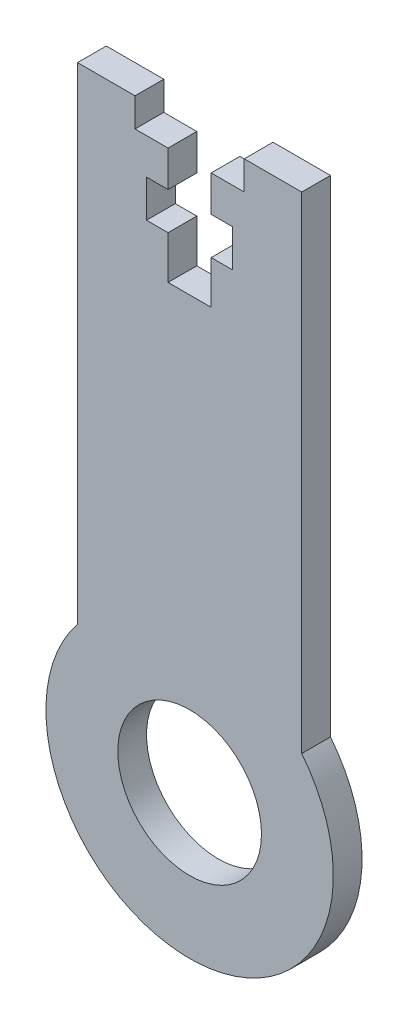
ISO-10303-21;
HEADER;
FILE_DESCRIPTION(('STEP AP214'),'2;1');
FILE_NAME('part.step','',(''),(''),'','','');
FILE_SCHEMA(('AUTOMOTIVE_DESIGN { 1 0 10303 214 1 1 1 1 }'));
ENDSEC;
DATA;
#1=APPLICATION_CONTEXT('core data for automotive mechanical design processes');
#2=APPLICATION_PROTOCOL_DEFINITION('international standard','automotive_design',2000,#1);
#3=PRODUCT_CONTEXT('',#1,'mechanical');
#4=PRODUCT('Part','Part','',(#3));
#5=PRODUCT_RELATED_PRODUCT_CATEGORY('part','',(#4));
#6=PRODUCT_DEFINITION_FORMATION('','',#4);
#7=PRODUCT_DEFINITION_CONTEXT('part definition',#1,'design');
#8=PRODUCT_DEFINITION('design','',#6,#7);
#9=PRODUCT_DEFINITION_SHAPE('','',#8);
#10=(LENGTH_UNIT() NAMED_UNIT(*) SI_UNIT(.MILLI.,.METRE.));
#11=(NAMED_UNIT(*) PLANE_ANGLE_UNIT() SI_UNIT($,.RADIAN.));
#12=(NAMED_UNIT(*) SI_UNIT($,.STERADIAN.) SOLID_ANGLE_UNIT());
#13=UNCERTAINTY_MEASURE_WITH_UNIT(LENGTH_MEASURE(1.E-05),#10,'distance_accuracy_value','');
#14=(GEOMETRIC_REPRESENTATION_CONTEXT(3) GLOBAL_UNCERTAINTY_ASSIGNED_CONTEXT((#13)) GLOBAL_UNIT_ASSIGNED_CONTEXT((#10,
#11,#12)) REPRESENTATION_CONTEXT('',''));
#15=CARTESIAN_POINT('',(0.,0.,0.));
#16=DIRECTION('',(0.,0.,1.));
#17=DIRECTION('',(1.,0.,0.));
#18=AXIS2_PLACEMENT_3D('',#15,#16,#17);
#19=CARTESIAN_POINT('',(-0.746895076948331,-11.2423879612165,2.));
#20=DIRECTION('',(0.,0.,-1.));
#21=DIRECTION('',(-1.,0.,0.));
#22=AXIS2_PLACEMENT_3D('',#19,#20,#21);
#23=PLANE('',#22);
#24=CARTESIAN_POINT('',(-0.746895076948331,-11.2423879612165,2.));
#25=DIRECTION('',(0.,0.,1.));
#26=DIRECTION('',(-1.,0.,0.));
#27=AXIS2_PLACEMENT_3D('',#24,#25,#26);
#28=CIRCLE('',#27,10.);
#29=CARTESIAN_POINT('',(-8.54689507694833,-4.98459282235165,2.));
#30=VERTEX_POINT('',#29);
#31=CARTESIAN_POINT('',(7.05310492305166,-4.98459282235164,2.));
#32=VERTEX_POINT('',#31);
#33=EDGE_CURVE('E243',#30,#32,#28,.T.);
#34=ORIENTED_EDGE('',*,*,#33,.T.);
#35=DIRECTION('',(0.,1.,0.));
#36=VECTOR('',#35,1.);
#37=CARTESIAN_POINT('',(7.05310492305166,-4.98459282235164,2.));
#38=LINE('',#37,#36);
#39=CARTESIAN_POINT('',(7.05310492305155,28.8576120387834,2.));
#40=VERTEX_POINT('',#39);
#41=EDGE_CURVE('E131',#32,#40,#38,.T.);
#42=ORIENTED_EDGE('',*,*,#41,.T.);
#43=DIRECTION('',(-1.,0.,0.));
#44=VECTOR('',#43,1.);
#45=CARTESIAN_POINT('',(3.05310492305092,28.8576120387834,2.));
#46=LINE('',#45,#44);
#47=CARTESIAN_POINT('',(3.05310492305092,28.8576120387834,2.));
#48=VERTEX_POINT('',#47);
#49=EDGE_CURVE('E294',#40,#48,#46,.T.);
#50=ORIENTED_EDGE('',*,*,#49,.T.);
#51=DIRECTION('',(0.,-1.,0.));
#52=VECTOR('',#51,1.);
#53=CARTESIAN_POINT('',(3.05310492305092,26.8576120387834,2.));
#54=LINE('',#53,#52);
#55=CARTESIAN_POINT('',(3.05310492305092,26.8576120387834,2.));
#56=VERTEX_POINT('',#55);
#57=EDGE_CURVE('E313',#48,#56,#54,.T.);
#58=ORIENTED_EDGE('',*,*,#57,.T.);
#59=DIRECTION('',(-1.,0.,0.));
#60=VECTOR('',#59,1.);
#61=CARTESIAN_POINT('',(0.753104923050919,26.8576120387834,2.));
#62=LINE('',#61,#60);
#63=CARTESIAN_POINT('',(0.753104923050919,26.8576120387834,2.));
#64=VERTEX_POINT('',#63);
#65=EDGE_CURVE('E310',#56,#64,#62,.T.);
#66=ORIENTED_EDGE('',*,*,#65,.T.);
#67=DIRECTION('',(0.,-1.,0.));
#68=VECTOR('',#67,1.);
#69=CARTESIAN_POINT('',(0.753104923050919,24.3576120387838,2.));
#70=LINE('',#69,#68);
#71=CARTESIAN_POINT('',(0.753104923050919,24.3576120387838,2.));
#72=VERTEX_POINT('',#71);
#73=EDGE_CURVE('E312',#64,#72,#70,.T.);
#74=ORIENTED_EDGE('',*,*,#73,.T.);
#75=DIRECTION('',(1.,0.,0.));
#76=VECTOR('',#75,1.);
#77=CARTESIAN_POINT('',(0.753104923050919,24.3576120387838,2.));
#78=LINE('',#77,#76);
#79=CARTESIAN_POINT('',(2.25310492305059,24.3576120387838,2.));
#80=VERTEX_POINT('',#79);
#81=EDGE_CURVE('E315',#72,#80,#78,.T.);
#82=ORIENTED_EDGE('',*,*,#81,.T.);
#83=DIRECTION('',(0.,-1.,0.));
#84=VECTOR('',#83,1.);
#85=CARTESIAN_POINT('',(2.25310492305059,24.3576120387838,2.));
#86=LINE('',#85,#84);
#87=CARTESIAN_POINT('',(2.25310492305059,21.757612038784,2.));
#88=VERTEX_POINT('',#87);
#89=EDGE_CURVE('E321',#80,#88,#86,.T.);
#90=ORIENTED_EDGE('',*,*,#89,.T.);
#91=DIRECTION('',(-1.,0.,0.));
#92=VECTOR('',#91,1.);
#93=CARTESIAN_POINT('',(2.25310492305059,21.757612038784,2.));
#94=LINE('',#93,#92);
#95=CARTESIAN_POINT('',(0.753104923037457,21.757612038784,2.));
#96=VERTEX_POINT('',#95);
#97=EDGE_CURVE('E323',#88,#96,#94,.T.);
#98=ORIENTED_EDGE('',*,*,#97,.T.);
#99=DIRECTION('',(0.,-1.,0.));
#100=VECTOR('',#99,1.);
#101=CARTESIAN_POINT('',(0.753104923037457,21.757612038784,2.));
#102=LINE('',#101,#100);
#103=CARTESIAN_POINT('',(0.753104923037457,18.7576120387835,2.));
#104=VERTEX_POINT('',#103);
#105=EDGE_CURVE('E325',#96,#104,#102,.T.);
#106=ORIENTED_EDGE('',*,*,#105,.T.);
#107=DIRECTION('',(-1.,0.,0.));
#108=VECTOR('',#107,1.);
#109=CARTESIAN_POINT('',(-2.24689507693412,18.7576120387835,2.));
#110=LINE('',#109,#108);
#111=CARTESIAN_POINT('',(-2.24689507693412,18.7576120387835,2.));
#112=VERTEX_POINT('',#111);
#113=EDGE_CURVE('E327',#104,#112,#110,.T.);
#114=ORIENTED_EDGE('',*,*,#113,.T.);
#115=DIRECTION('',(0.,1.,0.));
#116=VECTOR('',#115,1.);
#117=CARTESIAN_POINT('',(-2.24689507693412,21.7576120387831,2.));
#118=LINE('',#117,#116);
#119=CARTESIAN_POINT('',(-2.24689507693412,21.7576120387831,2.));
#120=VERTEX_POINT('',#119);
#121=EDGE_CURVE('E329',#112,#120,#118,.T.);
#122=ORIENTED_EDGE('',*,*,#121,.T.);
#123=DIRECTION('',(-1.,0.,0.));
#124=VECTOR('',#123,1.);
#125=CARTESIAN_POINT('',(-3.74689507694834,21.7576120387831,2.));
#126=LINE('',#125,#124);
#127=CARTESIAN_POINT('',(-3.74689507694834,21.7576120387831,2.));
#128=VERTEX_POINT('',#127);
#129=EDGE_CURVE('E331',#120,#128,#126,.T.);
#130=ORIENTED_EDGE('',*,*,#129,.T.);
#131=DIRECTION('',(0.,1.,0.));
#132=VECTOR('',#131,1.);
#133=CARTESIAN_POINT('',(-3.74689507694834,24.3576120387838,2.));
#134=LINE('',#133,#132);
#135=CARTESIAN_POINT('',(-3.74689507694834,24.3576120387838,2.));
#136=VERTEX_POINT('',#135);
#137=EDGE_CURVE('E333',#128,#136,#134,.T.);
#138=ORIENTED_EDGE('',*,*,#137,.T.);
#139=DIRECTION('',(1.,0.,0.));
#140=VECTOR('',#139,1.);
#141=CARTESIAN_POINT('',(-2.24689507694845,24.3576120387838,2.));
#142=LINE('',#141,#140);
#143=CARTESIAN_POINT('',(-2.24689507694845,24.3576120387838,2.));
#144=VERTEX_POINT('',#143);
#145=EDGE_CURVE('E335',#136,#144,#142,.T.);
#146=ORIENTED_EDGE('',*,*,#145,.T.);
#147=DIRECTION('',(0.,1.,0.));
#148=VECTOR('',#147,1.);
#149=CARTESIAN_POINT('',(-2.24689507694845,24.3576120387838,2.));
#150=LINE('',#149,#148);
#151=CARTESIAN_POINT('',(-2.24689507694845,26.8576120387834,2.));
#152=VERTEX_POINT('',#151);
#153=EDGE_CURVE('E337',#144,#152,#150,.T.);
#154=ORIENTED_EDGE('',*,*,#153,.T.);
#155=DIRECTION('',(-1.,0.,0.));
#156=VECTOR('',#155,1.);
#157=CARTESIAN_POINT('',(-4.54689507694845,26.8576120387834,2.));
#158=LINE('',#157,#156);
#159=CARTESIAN_POINT('',(-4.54689507694845,26.8576120387834,2.));
#160=VERTEX_POINT('',#159);
#161=EDGE_CURVE('E186',#152,#160,#158,.T.);
#162=ORIENTED_EDGE('',*,*,#161,.T.);
#163=DIRECTION('',(0.,1.,0.));
#164=VECTOR('',#163,1.);
#165=CARTESIAN_POINT('',(-4.54689507694845,28.8576120387834,2.));
#166=LINE('',#165,#164);
#167=CARTESIAN_POINT('',(-4.54689507694845,28.8576120387834,2.));
#168=VERTEX_POINT('',#167);
#169=EDGE_CURVE('E180',#160,#168,#166,.T.);
#170=ORIENTED_EDGE('',*,*,#169,.T.);
#171=DIRECTION('',(-1.,0.,0.));
#172=VECTOR('',#171,1.);
#173=CARTESIAN_POINT('',(-4.54689507694845,28.8576120387834,2.));
#174=LINE('',#173,#172);
#175=CARTESIAN_POINT('',(-8.54689507694845,28.8576120387834,2.));
#176=VERTEX_POINT('',#175);
#177=EDGE_CURVE('E184',#168,#176,#174,.T.);
#178=ORIENTED_EDGE('',*,*,#177,.T.);
#179=DIRECTION('',(0.,-1.,0.));
#180=VECTOR('',#179,1.);
#181=CARTESIAN_POINT('',(-8.54689507694845,28.8576120387834,2.));
#182=LINE('',#181,#180);
#183=EDGE_CURVE('E52',#176,#30,#182,.T.);
#184=ORIENTED_EDGE('',*,*,#183,.T.);
#185=EDGE_LOOP('',(#34,#42,#50,#58,#66,#74,#82,#90,#98,#106,#114,#122,#130,#138,#146,#154,#162,
#170,#178,#184));
#186=FACE_BOUND('',#185,.T.);
#187=CARTESIAN_POINT('',(-0.746895076948334,-11.2423879612165,2.));
#188=DIRECTION('',(0.,0.,1.));
#189=DIRECTION('',(1.,0.,0.));
#190=AXIS2_PLACEMENT_3D('',#187,#188,#189);
#191=CIRCLE('',#190,5.);
#192=CARTESIAN_POINT('',(4.25310492305167,-11.2423879612165,2.));
#193=VERTEX_POINT('',#192);
#194=EDGE_CURVE('E208',#193,#193,#191,.T.);
#195=ORIENTED_EDGE('',*,*,#194,.F.);
#196=EDGE_LOOP('',(#195));
#197=FACE_BOUND('',#196,.T.);
#198=ADVANCED_FACE('F35',(#186,#197),#23,.F.);
#199=CARTESIAN_POINT('',(-0.746895076948331,-11.2423879612165,0.));
#200=DIRECTION('',(0.,0.,-1.));
#201=DIRECTION('',(-1.,0.,0.));
#202=AXIS2_PLACEMENT_3D('',#199,#200,#201);
#203=PLANE('',#202);
#204=CARTESIAN_POINT('',(-0.746895076948331,-11.2423879612165,0.));
#205=DIRECTION('',(0.,0.,1.));
#206=DIRECTION('',(-1.,0.,0.));
#207=AXIS2_PLACEMENT_3D('',#204,#205,#206);
#208=CIRCLE('',#207,10.);
#209=CARTESIAN_POINT('',(-8.54689507694833,-4.98459282235165,0.));
#210=VERTEX_POINT('',#209);
#211=CARTESIAN_POINT('',(7.05310492305166,-4.98459282235164,0.));
#212=VERTEX_POINT('',#211);
#213=EDGE_CURVE('E204',#210,#212,#208,.T.);
#214=ORIENTED_EDGE('',*,*,#213,.F.);
#215=DIRECTION('',(0.,-1.,0.));
#216=VECTOR('',#215,1.);
#217=CARTESIAN_POINT('',(-8.54689507694845,28.8576120387834,0.));
#218=LINE('',#217,#216);
#219=CARTESIAN_POINT('',(-8.54689507694845,28.8576120387834,0.));
#220=VERTEX_POINT('',#219);
#221=EDGE_CURVE('E123',#220,#210,#218,.T.);
#222=ORIENTED_EDGE('',*,*,#221,.F.);
#223=DIRECTION('',(-1.,0.,0.));
#224=VECTOR('',#223,1.);
#225=CARTESIAN_POINT('',(-4.54689507694845,28.8576120387834,0.));
#226=LINE('',#225,#224);
#227=CARTESIAN_POINT('',(-4.54689507694845,28.8576120387834,0.));
#228=VERTEX_POINT('',#227);
#229=EDGE_CURVE('E117',#228,#220,#226,.T.);
#230=ORIENTED_EDGE('',*,*,#229,.F.);
#231=DIRECTION('',(0.,1.,0.));
#232=VECTOR('',#231,1.);
#233=CARTESIAN_POINT('',(-4.54689507694845,28.8576120387834,0.));
#234=LINE('',#233,#232);
#235=CARTESIAN_POINT('',(-4.54689507694845,26.8576120387834,0.));
#236=VERTEX_POINT('',#235);
#237=EDGE_CURVE('E194',#236,#228,#234,.T.);
#238=ORIENTED_EDGE('',*,*,#237,.F.);
#239=DIRECTION('',(-1.,0.,0.));
#240=VECTOR('',#239,1.);
#241=CARTESIAN_POINT('',(-4.54689507694845,26.8576120387834,0.));
#242=LINE('',#241,#240);
#243=CARTESIAN_POINT('',(-2.24689507694845,26.8576120387834,0.));
#244=VERTEX_POINT('',#243);
#245=EDGE_CURVE('E238',#244,#236,#242,.T.);
#246=ORIENTED_EDGE('',*,*,#245,.F.);
#247=DIRECTION('',(0.,1.,0.));
#248=VECTOR('',#247,1.);
#249=CARTESIAN_POINT('',(-2.24689507694845,24.3576120387838,0.));
#250=LINE('',#249,#248);
#251=CARTESIAN_POINT('',(-2.24689507694845,24.3576120387838,0.));
#252=VERTEX_POINT('',#251);
#253=EDGE_CURVE('E236',#252,#244,#250,.T.);
#254=ORIENTED_EDGE('',*,*,#253,.F.);
#255=DIRECTION('',(1.,0.,0.));
#256=VECTOR('',#255,1.);
#257=CARTESIAN_POINT('',(-2.24689507694845,24.3576120387838,0.));
#258=LINE('',#257,#256);
#259=CARTESIAN_POINT('',(-3.74689507694834,24.3576120387838,0.));
#260=VERTEX_POINT('',#259);
#261=EDGE_CURVE('E234',#260,#252,#258,.T.);
#262=ORIENTED_EDGE('',*,*,#261,.F.);
#263=DIRECTION('',(0.,1.,0.));
#264=VECTOR('',#263,1.);
#265=CARTESIAN_POINT('',(-3.74689507694834,24.3576120387838,0.));
#266=LINE('',#265,#264);
#267=CARTESIAN_POINT('',(-3.74689507694834,21.7576120387831,0.));
#268=VERTEX_POINT('',#267);
#269=EDGE_CURVE('E232',#268,#260,#266,.T.);
#270=ORIENTED_EDGE('',*,*,#269,.F.);
#271=DIRECTION('',(-1.,0.,0.));
#272=VECTOR('',#271,1.);
#273=CARTESIAN_POINT('',(-3.74689507694834,21.7576120387831,0.));
#274=LINE('',#273,#272);
#275=CARTESIAN_POINT('',(-2.24689507693412,21.7576120387831,0.));
#276=VERTEX_POINT('',#275);
#277=EDGE_CURVE('E230',#276,#268,#274,.T.);
#278=ORIENTED_EDGE('',*,*,#277,.F.);
#279=DIRECTION('',(0.,1.,0.));
#280=VECTOR('',#279,1.);
#281=CARTESIAN_POINT('',(-2.24689507693412,21.7576120387831,0.));
#282=LINE('',#281,#280);
#283=CARTESIAN_POINT('',(-2.24689507693412,18.7576120387835,0.));
#284=VERTEX_POINT('',#283);
#285=EDGE_CURVE('E228',#284,#276,#282,.T.);
#286=ORIENTED_EDGE('',*,*,#285,.F.);
#287=DIRECTION('',(-1.,0.,0.));
#288=VECTOR('',#287,1.);
#289=CARTESIAN_POINT('',(-2.24689507693412,18.7576120387835,0.));
#290=LINE('',#289,#288);
#291=CARTESIAN_POINT('',(0.753104923037457,18.7576120387835,0.));
#292=VERTEX_POINT('',#291);
#293=EDGE_CURVE('E226',#292,#284,#290,.T.);
#294=ORIENTED_EDGE('',*,*,#293,.F.);
#295=DIRECTION('',(0.,-1.,0.));
#296=VECTOR('',#295,1.);
#297=CARTESIAN_POINT('',(0.753104923037457,21.757612038784,0.));
#298=LINE('',#297,#296);
#299=CARTESIAN_POINT('',(0.753104923037457,21.757612038784,0.));
#300=VERTEX_POINT('',#299);
#301=EDGE_CURVE('E224',#300,#292,#298,.T.);
#302=ORIENTED_EDGE('',*,*,#301,.F.);
#303=DIRECTION('',(-1.,0.,0.));
#304=VECTOR('',#303,1.);
#305=CARTESIAN_POINT('',(2.25310492305059,21.757612038784,0.));
#306=LINE('',#305,#304);
#307=CARTESIAN_POINT('',(2.25310492305059,21.757612038784,0.));
#308=VERTEX_POINT('',#307);
#309=EDGE_CURVE('E222',#308,#300,#306,.T.);
#310=ORIENTED_EDGE('',*,*,#309,.F.);
#311=DIRECTION('',(0.,-1.,0.));
#312=VECTOR('',#311,1.);
#313=CARTESIAN_POINT('',(2.25310492305059,24.3576120387838,0.));
#314=LINE('',#313,#312);
#315=CARTESIAN_POINT('',(2.25310492305059,24.3576120387838,0.));
#316=VERTEX_POINT('',#315);
#317=EDGE_CURVE('E220',#316,#308,#314,.T.);
#318=ORIENTED_EDGE('',*,*,#317,.F.);
#319=DIRECTION('',(1.,0.,0.));
#320=VECTOR('',#319,1.);
#321=CARTESIAN_POINT('',(0.753104923050919,24.3576120387838,0.));
#322=LINE('',#321,#320);
#323=CARTESIAN_POINT('',(0.753104923050919,24.3576120387838,0.));
#324=VERTEX_POINT('',#323);
#325=EDGE_CURVE('E218',#324,#316,#322,.T.);
#326=ORIENTED_EDGE('',*,*,#325,.F.);
#327=DIRECTION('',(0.,-1.,0.));
#328=VECTOR('',#327,1.);
#329=CARTESIAN_POINT('',(0.753104923050919,24.3576120387838,0.));
#330=LINE('',#329,#328);
#331=CARTESIAN_POINT('',(0.753104923050919,26.8576120387834,0.));
#332=VERTEX_POINT('',#331);
#333=EDGE_CURVE('E216',#332,#324,#330,.T.);
#334=ORIENTED_EDGE('',*,*,#333,.F.);
#335=DIRECTION('',(-1.,0.,0.));
#336=VECTOR('',#335,1.);
#337=CARTESIAN_POINT('',(0.753104923050919,26.8576120387834,0.));
#338=LINE('',#337,#336);
#339=CARTESIAN_POINT('',(3.05310492305092,26.8576120387834,0.));
#340=VERTEX_POINT('',#339);
#341=EDGE_CURVE('E214',#340,#332,#338,.T.);
#342=ORIENTED_EDGE('',*,*,#341,.F.);
#343=DIRECTION('',(0.,-1.,0.));
#344=VECTOR('',#343,1.);
#345=CARTESIAN_POINT('',(3.05310492305092,26.8576120387834,0.));
#346=LINE('',#345,#344);
#347=CARTESIAN_POINT('',(3.05310492305092,28.8576120387834,0.));
#348=VERTEX_POINT('',#347);
#349=EDGE_CURVE('E212',#348,#340,#346,.T.);
#350=ORIENTED_EDGE('',*,*,#349,.F.);
#351=DIRECTION('',(-1.,0.,0.));
#352=VECTOR('',#351,1.);
#353=CARTESIAN_POINT('',(3.05310492305092,28.8576120387834,0.));
#354=LINE('',#353,#352);
#355=CARTESIAN_POINT('',(7.05310492305155,28.8576120387834,0.));
#356=VERTEX_POINT('',#355);
#357=EDGE_CURVE('E210',#356,#348,#354,.T.);
#358=ORIENTED_EDGE('',*,*,#357,.F.);
#359=DIRECTION('',(0.,1.,0.));
#360=VECTOR('',#359,1.);
#361=CARTESIAN_POINT('',(7.05310492305166,-4.98459282235164,0.));
#362=LINE('',#361,#360);
#363=EDGE_CURVE('E207',#212,#356,#362,.T.);
#364=ORIENTED_EDGE('',*,*,#363,.F.);
#365=EDGE_LOOP('',(#214,#222,#230,#238,#246,#254,#262,#270,#278,#286,#294,#302,#310,#318,#326,
#334,#342,#350,#358,#364));
#366=FACE_BOUND('',#365,.T.);
#367=CARTESIAN_POINT('',(-0.746895076948334,-11.2423879612165,0.));
#368=DIRECTION('',(0.,0.,1.));
#369=DIRECTION('',(1.,0.,0.));
#370=AXIS2_PLACEMENT_3D('',#367,#368,#369);
#371=CIRCLE('',#370,5.);
#372=CARTESIAN_POINT('',(4.25310492305167,-11.2423879612165,0.));
#373=VERTEX_POINT('',#372);
#374=EDGE_CURVE('E588',#373,#373,#371,.T.);
#375=ORIENTED_EDGE('',*,*,#374,.T.);
#376=EDGE_LOOP('',(#375));
#377=FACE_BOUND('',#376,.T.);
#378=ADVANCED_FACE('F298',(#366,#377),#203,.T.);
#379=CARTESIAN_POINT('',(-0.746895076948331,-11.2423879612165,2.));
#380=DIRECTION('',(0.,0.,-1.));
#381=DIRECTION('',(-1.,0.,0.));
#382=AXIS2_PLACEMENT_3D('',#379,#380,#381);
#383=CYLINDRICAL_SURFACE('',#382,10.);
#384=ORIENTED_EDGE('',*,*,#213,.T.);
#385=DIRECTION('',(0.,0.,-1.));
#386=VECTOR('',#385,1.);
#387=CARTESIAN_POINT('',(7.05310492305166,-4.98459282235164,2.));
#388=LINE('',#387,#386);
#389=EDGE_CURVE('E11',#32,#212,#388,.T.);
#390=ORIENTED_EDGE('',*,*,#389,.F.);
#391=ORIENTED_EDGE('',*,*,#33,.F.);
#392=DIRECTION('',(0.,0.,-1.));
#393=VECTOR('',#392,1.);
#394=CARTESIAN_POINT('',(-8.54689507694833,-4.98459282235165,2.));
#395=LINE('',#394,#393);
#396=EDGE_CURVE('E200',#30,#210,#395,.T.);
#397=ORIENTED_EDGE('',*,*,#396,.T.);
#398=EDGE_LOOP('',(#384,#390,#391,#397));
#399=FACE_BOUND('',#398,.T.);
#400=ADVANCED_FACE('F37',(#399),#383,.T.);
#401=CARTESIAN_POINT('',(7.05310492305166,-4.98459282235164,2.));
#402=DIRECTION('',(-1.,0.,0.));
#403=DIRECTION('',(0.,-1.,0.));
#404=AXIS2_PLACEMENT_3D('',#401,#402,#403);
#405=PLANE('',#404);
#406=ORIENTED_EDGE('',*,*,#363,.T.);
#407=DIRECTION('',(0.,0.,-1.));
#408=VECTOR('',#407,1.);
#409=CARTESIAN_POINT('',(7.05310492305155,28.8576120387834,2.));
#410=LINE('',#409,#408);
#411=EDGE_CURVE('E44',#40,#356,#410,.T.);
#412=ORIENTED_EDGE('',*,*,#411,.F.);
#413=ORIENTED_EDGE('',*,*,#41,.F.);
#414=ORIENTED_EDGE('',*,*,#389,.T.);
#415=EDGE_LOOP('',(#406,#412,#413,#414));
#416=FACE_BOUND('',#415,.T.);
#417=ADVANCED_FACE('F371',(#416),#405,.F.);
#418=CARTESIAN_POINT('',(3.05310492305092,28.8576120387834,2.));
#419=DIRECTION('',(0.,-1.,0.));
#420=DIRECTION('',(0.,0.,-1.));
#421=AXIS2_PLACEMENT_3D('',#418,#419,#420);
#422=PLANE('',#421);
#423=ORIENTED_EDGE('',*,*,#357,.T.);
#424=DIRECTION('',(0.,0.,-1.));
#425=VECTOR('',#424,1.);
#426=CARTESIAN_POINT('',(3.05310492305092,28.8576120387834,2.));
#427=LINE('',#426,#425);
#428=EDGE_CURVE('E286',#48,#348,#427,.T.);
#429=ORIENTED_EDGE('',*,*,#428,.F.);
#430=ORIENTED_EDGE('',*,*,#49,.F.);
#431=ORIENTED_EDGE('',*,*,#411,.T.);
#432=EDGE_LOOP('',(#423,#429,#430,#431));
#433=FACE_BOUND('',#432,.T.);
#434=ADVANCED_FACE('F292',(#433),#422,.F.);
#435=CARTESIAN_POINT('',(3.05310492305092,26.8576120387834,2.));
#436=DIRECTION('',(1.,0.,0.));
#437=DIRECTION('',(0.,0.,-1.));
#438=AXIS2_PLACEMENT_3D('',#435,#436,#437);
#439=PLANE('',#438);
#440=ORIENTED_EDGE('',*,*,#349,.T.);
#441=DIRECTION('',(0.,0.,-1.));
#442=VECTOR('',#441,1.);
#443=CARTESIAN_POINT('',(3.05310492305092,26.8576120387834,2.));
#444=LINE('',#443,#442);
#445=EDGE_CURVE('E283',#56,#340,#444,.T.);
#446=ORIENTED_EDGE('',*,*,#445,.F.);
#447=ORIENTED_EDGE('',*,*,#57,.F.);
#448=ORIENTED_EDGE('',*,*,#428,.T.);
#449=EDGE_LOOP('',(#440,#446,#447,#448));
#450=FACE_BOUND('',#449,.T.);
#451=ADVANCED_FACE('F304',(#450),#439,.F.);
#452=CARTESIAN_POINT('',(0.753104923050919,26.8576120387834,2.));
#453=DIRECTION('',(0.,-1.,0.));
#454=DIRECTION('',(0.,0.,-1.));
#455=AXIS2_PLACEMENT_3D('',#452,#453,#454);
#456=PLANE('',#455);
#457=ORIENTED_EDGE('',*,*,#341,.T.);
#458=DIRECTION('',(0.,0.,-1.));
#459=VECTOR('',#458,1.);
#460=CARTESIAN_POINT('',(0.753104923050919,26.8576120387834,2.));
#461=LINE('',#460,#459);
#462=EDGE_CURVE('E280',#64,#332,#461,.T.);
#463=ORIENTED_EDGE('',*,*,#462,.F.);
#464=ORIENTED_EDGE('',*,*,#65,.F.);
#465=ORIENTED_EDGE('',*,*,#445,.T.);
#466=EDGE_LOOP('',(#457,#463,#464,#465));
#467=FACE_BOUND('',#466,.T.);
#468=ADVANCED_FACE('F308',(#467),#456,.F.);
#469=CARTESIAN_POINT('',(0.753104923050919,24.3576120387838,2.));
#470=DIRECTION('',(1.,0.,0.));
#471=DIRECTION('',(0.,0.,-1.));
#472=AXIS2_PLACEMENT_3D('',#469,#470,#471);
#473=PLANE('',#472);
#474=ORIENTED_EDGE('',*,*,#333,.T.);
#475=DIRECTION('',(0.,0.,-1.));
#476=VECTOR('',#475,1.);
#477=CARTESIAN_POINT('',(0.753104923050919,24.3576120387838,2.));
#478=LINE('',#477,#476);
#479=EDGE_CURVE('E277',#72,#324,#478,.T.);
#480=ORIENTED_EDGE('',*,*,#479,.F.);
#481=ORIENTED_EDGE('',*,*,#73,.F.);
#482=ORIENTED_EDGE('',*,*,#462,.T.);
#483=EDGE_LOOP('',(#474,#480,#481,#482));
#484=FACE_BOUND('',#483,.T.);
#485=ADVANCED_FACE('F384',(#484),#473,.F.);
#486=CARTESIAN_POINT('',(0.753104923050919,24.3576120387838,2.));
#487=DIRECTION('',(0.,1.,0.));
#488=DIRECTION('',(0.,0.,1.));
#489=AXIS2_PLACEMENT_3D('',#486,#487,#488);
#490=PLANE('',#489);
#491=ORIENTED_EDGE('',*,*,#325,.T.);
#492=DIRECTION('',(0.,0.,-1.));
#493=VECTOR('',#492,1.);
#494=CARTESIAN_POINT('',(2.25310492305059,24.3576120387838,2.));
#495=LINE('',#494,#493);
#496=EDGE_CURVE('E274',#80,#316,#495,.T.);
#497=ORIENTED_EDGE('',*,*,#496,.F.);
#498=ORIENTED_EDGE('',*,*,#81,.F.);
#499=ORIENTED_EDGE('',*,*,#479,.T.);
#500=EDGE_LOOP('',(#491,#497,#498,#499));
#501=FACE_BOUND('',#500,.T.);
#502=ADVANCED_FACE('F387',(#501),#490,.F.);
#503=CARTESIAN_POINT('',(2.25310492305059,24.3576120387838,2.));
#504=DIRECTION('',(1.,0.,0.));
#505=DIRECTION('',(0.,0.,-1.));
#506=AXIS2_PLACEMENT_3D('',#503,#504,#505);
#507=PLANE('',#506);
#508=ORIENTED_EDGE('',*,*,#317,.T.);
#509=DIRECTION('',(0.,0.,-1.));
#510=VECTOR('',#509,1.);
#511=CARTESIAN_POINT('',(2.25310492305059,21.757612038784,2.));
#512=LINE('',#511,#510);
#513=EDGE_CURVE('E271',#88,#308,#512,.T.);
#514=ORIENTED_EDGE('',*,*,#513,.F.);
#515=ORIENTED_EDGE('',*,*,#89,.F.);
#516=ORIENTED_EDGE('',*,*,#496,.T.);
#517=EDGE_LOOP('',(#508,#514,#515,#516));
#518=FACE_BOUND('',#517,.T.);
#519=ADVANCED_FACE('F391',(#518),#507,.F.);
#520=CARTESIAN_POINT('',(2.25310492305059,21.757612038784,2.));
#521=DIRECTION('',(0.,-1.,0.));
#522=DIRECTION('',(0.,0.,-1.));
#523=AXIS2_PLACEMENT_3D('',#520,#521,#522);
#524=PLANE('',#523);
#525=ORIENTED_EDGE('',*,*,#309,.T.);
#526=DIRECTION('',(0.,0.,-1.));
#527=VECTOR('',#526,1.);
#528=CARTESIAN_POINT('',(0.753104923037457,21.757612038784,2.));
#529=LINE('',#528,#527);
#530=EDGE_CURVE('E268',#96,#300,#529,.T.);
#531=ORIENTED_EDGE('',*,*,#530,.F.);
#532=ORIENTED_EDGE('',*,*,#97,.F.);
#533=ORIENTED_EDGE('',*,*,#513,.T.);
#534=EDGE_LOOP('',(#525,#531,#532,#533));
#535=FACE_BOUND('',#534,.T.);
#536=ADVANCED_FACE('F395',(#535),#524,.F.);
#537=CARTESIAN_POINT('',(0.753104923037457,21.757612038784,2.));
#538=DIRECTION('',(1.,0.,0.));
#539=DIRECTION('',(0.,1.,0.));
#540=AXIS2_PLACEMENT_3D('',#537,#538,#539);
#541=PLANE('',#540);
#542=ORIENTED_EDGE('',*,*,#301,.T.);
#543=DIRECTION('',(0.,0.,-1.));
#544=VECTOR('',#543,1.);
#545=CARTESIAN_POINT('',(0.753104923037457,18.7576120387835,2.));
#546=LINE('',#545,#544);
#547=EDGE_CURVE('E265',#104,#292,#546,.T.);
#548=ORIENTED_EDGE('',*,*,#547,.F.);
#549=ORIENTED_EDGE('',*,*,#105,.F.);
#550=ORIENTED_EDGE('',*,*,#530,.T.);
#551=EDGE_LOOP('',(#542,#548,#549,#550));
#552=FACE_BOUND('',#551,.T.);
#553=ADVANCED_FACE('F399',(#552),#541,.F.);
#554=CARTESIAN_POINT('',(-2.24689507693412,18.7576120387835,2.));
#555=DIRECTION('',(0.,-1.,0.));
#556=DIRECTION('',(0.,0.,-1.));
#557=AXIS2_PLACEMENT_3D('',#554,#555,#556);
#558=PLANE('',#557);
#559=ORIENTED_EDGE('',*,*,#293,.T.);
#560=DIRECTION('',(0.,0.,-1.));
#561=VECTOR('',#560,1.);
#562=CARTESIAN_POINT('',(-2.24689507693412,18.7576120387835,2.));
#563=LINE('',#562,#561);
#564=EDGE_CURVE('E262',#112,#284,#563,.T.);
#565=ORIENTED_EDGE('',*,*,#564,.F.);
#566=ORIENTED_EDGE('',*,*,#113,.F.);
#567=ORIENTED_EDGE('',*,*,#547,.T.);
#568=EDGE_LOOP('',(#559,#565,#566,#567));
#569=FACE_BOUND('',#568,.T.);
#570=ADVANCED_FACE('F403',(#569),#558,.F.);
#571=CARTESIAN_POINT('',(-2.24689507693412,21.7576120387831,2.));
#572=DIRECTION('',(-1.,0.,0.));
#573=DIRECTION('',(0.,-1.,0.));
#574=AXIS2_PLACEMENT_3D('',#571,#572,#573);
#575=PLANE('',#574);
#576=ORIENTED_EDGE('',*,*,#285,.T.);
#577=DIRECTION('',(0.,0.,-1.));
#578=VECTOR('',#577,1.);
#579=CARTESIAN_POINT('',(-2.24689507693412,21.7576120387831,2.));
#580=LINE('',#579,#578);
#581=EDGE_CURVE('E259',#120,#276,#580,.T.);
#582=ORIENTED_EDGE('',*,*,#581,.F.);
#583=ORIENTED_EDGE('',*,*,#121,.F.);
#584=ORIENTED_EDGE('',*,*,#564,.T.);
#585=EDGE_LOOP('',(#576,#582,#583,#584));
#586=FACE_BOUND('',#585,.T.);
#587=ADVANCED_FACE('F407',(#586),#575,.F.);
#588=CARTESIAN_POINT('',(-3.74689507694834,21.7576120387831,2.));
#589=DIRECTION('',(0.,-1.,0.));
#590=DIRECTION('',(0.,0.,-1.));
#591=AXIS2_PLACEMENT_3D('',#588,#589,#590);
#592=PLANE('',#591);
#593=ORIENTED_EDGE('',*,*,#277,.T.);
#594=DIRECTION('',(0.,0.,-1.));
#595=VECTOR('',#594,1.);
#596=CARTESIAN_POINT('',(-3.74689507694834,21.7576120387831,2.));
#597=LINE('',#596,#595);
#598=EDGE_CURVE('E256',#128,#268,#597,.T.);
#599=ORIENTED_EDGE('',*,*,#598,.F.);
#600=ORIENTED_EDGE('',*,*,#129,.F.);
#601=ORIENTED_EDGE('',*,*,#581,.T.);
#602=EDGE_LOOP('',(#593,#599,#600,#601));
#603=FACE_BOUND('',#602,.T.);
#604=ADVANCED_FACE('F411',(#603),#592,.F.);
#605=CARTESIAN_POINT('',(-3.74689507694834,24.3576120387838,2.));
#606=DIRECTION('',(-1.,0.,0.));
#607=DIRECTION('',(0.,-1.,0.));
#608=AXIS2_PLACEMENT_3D('',#605,#606,#607);
#609=PLANE('',#608);
#610=ORIENTED_EDGE('',*,*,#269,.T.);
#611=DIRECTION('',(0.,0.,-1.));
#612=VECTOR('',#611,1.);
#613=CARTESIAN_POINT('',(-3.74689507694834,24.3576120387838,2.));
#614=LINE('',#613,#612);
#615=EDGE_CURVE('E253',#136,#260,#614,.T.);
#616=ORIENTED_EDGE('',*,*,#615,.F.);
#617=ORIENTED_EDGE('',*,*,#137,.F.);
#618=ORIENTED_EDGE('',*,*,#598,.T.);
#619=EDGE_LOOP('',(#610,#616,#617,#618));
#620=FACE_BOUND('',#619,.T.);
#621=ADVANCED_FACE('F415',(#620),#609,.F.);
#622=CARTESIAN_POINT('',(-2.24689507694845,24.3576120387838,2.));
#623=DIRECTION('',(0.,1.,0.));
#624=DIRECTION('',(0.,0.,1.));
#625=AXIS2_PLACEMENT_3D('',#622,#623,#624);
#626=PLANE('',#625);
#627=ORIENTED_EDGE('',*,*,#261,.T.);
#628=DIRECTION('',(0.,0.,-1.));
#629=VECTOR('',#628,1.);
#630=CARTESIAN_POINT('',(-2.24689507694845,24.3576120387838,2.));
#631=LINE('',#630,#629);
#632=EDGE_CURVE('E250',#144,#252,#631,.T.);
#633=ORIENTED_EDGE('',*,*,#632,.F.);
#634=ORIENTED_EDGE('',*,*,#145,.F.);
#635=ORIENTED_EDGE('',*,*,#615,.T.);
#636=EDGE_LOOP('',(#627,#633,#634,#635));
#637=FACE_BOUND('',#636,.T.);
#638=ADVANCED_FACE('F419',(#637),#626,.F.);
#639=CARTESIAN_POINT('',(-2.24689507694845,24.3576120387838,2.));
#640=DIRECTION('',(-1.,0.,0.));
#641=DIRECTION('',(0.,-1.,0.));
#642=AXIS2_PLACEMENT_3D('',#639,#640,#641);
#643=PLANE('',#642);
#644=ORIENTED_EDGE('',*,*,#253,.T.);
#645=DIRECTION('',(0.,0.,-1.));
#646=VECTOR('',#645,1.);
#647=CARTESIAN_POINT('',(-2.24689507694845,26.8576120387834,2.));
#648=LINE('',#647,#646);
#649=EDGE_CURVE('E247',#152,#244,#648,.T.);
#650=ORIENTED_EDGE('',*,*,#649,.F.);
#651=ORIENTED_EDGE('',*,*,#153,.F.);
#652=ORIENTED_EDGE('',*,*,#632,.T.);
#653=EDGE_LOOP('',(#644,#650,#651,#652));
#654=FACE_BOUND('',#653,.T.);
#655=ADVANCED_FACE('F343',(#654),#643,.F.);
#656=CARTESIAN_POINT('',(-4.54689507694845,26.8576120387834,2.));
#657=DIRECTION('',(0.,-1.,0.));
#658=DIRECTION('',(0.,0.,-1.));
#659=AXIS2_PLACEMENT_3D('',#656,#657,#658);
#660=PLANE('',#659);
#661=ORIENTED_EDGE('',*,*,#245,.T.);
#662=DIRECTION('',(0.,0.,-1.));
#663=VECTOR('',#662,1.);
#664=CARTESIAN_POINT('',(-4.54689507694845,26.8576120387834,2.));
#665=LINE('',#664,#663);
#666=EDGE_CURVE('E195',#160,#236,#665,.T.);
#667=ORIENTED_EDGE('',*,*,#666,.F.);
#668=ORIENTED_EDGE('',*,*,#161,.F.);
#669=ORIENTED_EDGE('',*,*,#649,.T.);
#670=EDGE_LOOP('',(#661,#667,#668,#669));
#671=FACE_BOUND('',#670,.T.);
#672=ADVANCED_FACE('F347',(#671),#660,.F.);
#673=CARTESIAN_POINT('',(-4.54689507694845,28.8576120387834,2.));
#674=DIRECTION('',(-1.,0.,0.));
#675=DIRECTION('',(0.,0.,1.));
#676=AXIS2_PLACEMENT_3D('',#673,#674,#675);
#677=PLANE('',#676);
#678=ORIENTED_EDGE('',*,*,#237,.T.);
#679=DIRECTION('',(0.,0.,-1.));
#680=VECTOR('',#679,1.);
#681=CARTESIAN_POINT('',(-4.54689507694845,28.8576120387834,2.));
#682=LINE('',#681,#680);
#683=EDGE_CURVE('E191',#168,#228,#682,.T.);
#684=ORIENTED_EDGE('',*,*,#683,.F.);
#685=ORIENTED_EDGE('',*,*,#169,.F.);
#686=ORIENTED_EDGE('',*,*,#666,.T.);
#687=EDGE_LOOP('',(#678,#684,#685,#686));
#688=FACE_BOUND('',#687,.T.);
#689=ADVANCED_FACE('F192',(#688),#677,.F.);
#690=CARTESIAN_POINT('',(-4.54689507694845,28.8576120387834,2.));
#691=DIRECTION('',(0.,-1.,0.));
#692=DIRECTION('',(0.,0.,-1.));
#693=AXIS2_PLACEMENT_3D('',#690,#691,#692);
#694=PLANE('',#693);
#695=ORIENTED_EDGE('',*,*,#229,.T.);
#696=DIRECTION('',(0.,0.,-1.));
#697=VECTOR('',#696,1.);
#698=CARTESIAN_POINT('',(-8.54689507694845,28.8576120387834,2.));
#699=LINE('',#698,#697);
#700=EDGE_CURVE('E196',#176,#220,#699,.T.);
#701=ORIENTED_EDGE('',*,*,#700,.F.);
#702=ORIENTED_EDGE('',*,*,#177,.F.);
#703=ORIENTED_EDGE('',*,*,#683,.T.);
#704=EDGE_LOOP('',(#695,#701,#702,#703));
#705=FACE_BOUND('',#704,.T.);
#706=ADVANCED_FACE('F198',(#705),#694,.F.);
#707=CARTESIAN_POINT('',(-8.54689507694845,28.8576120387834,2.));
#708=DIRECTION('',(1.,0.,0.));
#709=DIRECTION('',(0.,1.,0.));
#710=AXIS2_PLACEMENT_3D('',#707,#708,#709);
#711=PLANE('',#710);
#712=ORIENTED_EDGE('',*,*,#221,.T.);
#713=ORIENTED_EDGE('',*,*,#396,.F.);
#714=ORIENTED_EDGE('',*,*,#183,.F.);
#715=ORIENTED_EDGE('',*,*,#700,.T.);
#716=EDGE_LOOP('',(#712,#713,#714,#715));
#717=FACE_BOUND('',#716,.T.);
#718=ADVANCED_FACE('F351',(#717),#711,.F.);
#719=CARTESIAN_POINT('',(-0.746895076948334,-11.2423879612165,2.));
#720=DIRECTION('',(0.,0.,-1.));
#721=DIRECTION('',(-1.,0.,0.));
#722=AXIS2_PLACEMENT_3D('',#719,#720,#721);
#723=CYLINDRICAL_SURFACE('',#722,5.);
#724=ORIENTED_EDGE('',*,*,#194,.T.);
#725=EDGE_LOOP('',(#724));
#726=FACE_BOUND('',#725,.T.);
#727=ORIENTED_EDGE('',*,*,#374,.F.);
#728=EDGE_LOOP('',(#727));
#729=FACE_BOUND('',#728,.T.);
#730=ADVANCED_FACE('F353',(#726,#729),#723,.F.);
#731=CLOSED_SHELL('',(#198,#378,#400,#417,#434,#451,#468,#485,#502,#519,#536,#553,#570,#587,
#604,#621,#638,#655,#672,#689,#706,#718,#730));
#732=MANIFOLD_SOLID_BREP('B2',#731);
#733=ADVANCED_BREP_SHAPE_REPRESENTATION('',(#18,#732),#14);
#734=SHAPE_DEFINITION_REPRESENTATION(#9,#733);
ENDSEC;
END-ISO-10303-21;
